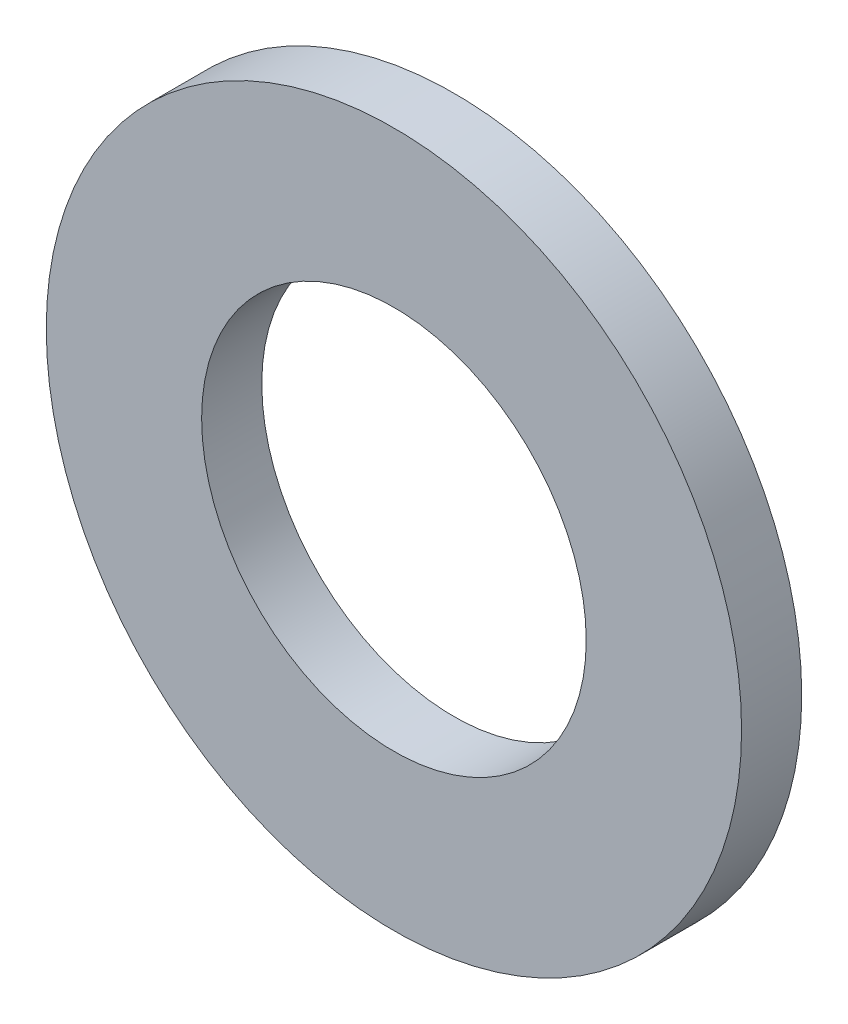
ISO-10303-21;
HEADER;
FILE_DESCRIPTION(('STEP AP214'),'2;1');
FILE_NAME('part.step','',(''),(''),'','','');
FILE_SCHEMA(('AUTOMOTIVE_DESIGN { 1 0 10303 214 1 1 1 1 }'));
ENDSEC;
DATA;
#1=APPLICATION_CONTEXT('core data for automotive mechanical design processes');
#2=APPLICATION_PROTOCOL_DEFINITION('international standard','automotive_design',2000,#1);
#3=PRODUCT_CONTEXT('',#1,'mechanical');
#4=PRODUCT('Part','Part','',(#3));
#5=PRODUCT_RELATED_PRODUCT_CATEGORY('part','',(#4));
#6=PRODUCT_DEFINITION_FORMATION('','',#4);
#7=PRODUCT_DEFINITION_CONTEXT('part definition',#1,'design');
#8=PRODUCT_DEFINITION('design','',#6,#7);
#9=PRODUCT_DEFINITION_SHAPE('','',#8);
#10=(LENGTH_UNIT() NAMED_UNIT(*) SI_UNIT(.MILLI.,.METRE.));
#11=(NAMED_UNIT(*) PLANE_ANGLE_UNIT() SI_UNIT($,.RADIAN.));
#12=(NAMED_UNIT(*) SI_UNIT($,.STERADIAN.) SOLID_ANGLE_UNIT());
#13=UNCERTAINTY_MEASURE_WITH_UNIT(LENGTH_MEASURE(1.E-05),#10,'distance_accuracy_value','');
#14=(GEOMETRIC_REPRESENTATION_CONTEXT(3) GLOBAL_UNCERTAINTY_ASSIGNED_CONTEXT((#13)) GLOBAL_UNIT_ASSIGNED_CONTEXT((#10,
#11,#12)) REPRESENTATION_CONTEXT('',''));
#15=CARTESIAN_POINT('',(0.,0.,0.));
#16=DIRECTION('',(0.,0.,1.));
#17=DIRECTION('',(1.,0.,0.));
#18=AXIS2_PLACEMENT_3D('',#15,#16,#17);
#19=CARTESIAN_POINT('',(0.,0.,0.806449999999998));
#20=DIRECTION('',(0.,0.,1.));
#21=DIRECTION('',(1.,0.,0.));
#22=AXIS2_PLACEMENT_3D('',#19,#20,#21);
#23=PLANE('',#22);
#24=CARTESIAN_POINT('',(0.,0.,0.806449999999998));
#25=DIRECTION('',(0.,0.,1.));
#26=DIRECTION('',(1.,0.,0.));
#27=AXIS2_PLACEMENT_3D('',#24,#25,#26);
#28=CIRCLE('',#27,9.3218);
#29=CARTESIAN_POINT('',(9.3218,0.,0.806449999999998));
#30=VERTEX_POINT('',#29);
#31=EDGE_CURVE('E10',#30,#30,#28,.T.);
#32=ORIENTED_EDGE('',*,*,#31,.T.);
#33=EDGE_LOOP('',(#32));
#34=FACE_BOUND('',#33,.T.);
#35=CARTESIAN_POINT('',(0.,0.,0.806449999999998));
#36=DIRECTION('',(0.,0.,1.));
#37=DIRECTION('',(1.,0.,0.));
#38=AXIS2_PLACEMENT_3D('',#35,#36,#37);
#39=CIRCLE('',#38,5.1562);
#40=CARTESIAN_POINT('',(5.1562,0.,0.806449999999998));
#41=VERTEX_POINT('',#40);
#42=EDGE_CURVE('E44',#41,#41,#39,.T.);
#43=ORIENTED_EDGE('',*,*,#42,.F.);
#44=EDGE_LOOP('',(#43));
#45=FACE_BOUND('',#44,.T.);
#46=ADVANCED_FACE('F37',(#34,#45),#23,.T.);
#47=CARTESIAN_POINT('',(0.,0.,0.806449999999998));
#48=DIRECTION('',(0.,0.,-1.));
#49=DIRECTION('',(-1.,0.,0.));
#50=AXIS2_PLACEMENT_3D('',#47,#48,#49);
#51=CYLINDRICAL_SURFACE('',#50,9.3218);
#52=ORIENTED_EDGE('',*,*,#31,.F.);
#53=EDGE_LOOP('',(#52));
#54=FACE_BOUND('',#53,.T.);
#55=CARTESIAN_POINT('',(0.,0.,-0.806450000000002));
#56=DIRECTION('',(0.,0.,1.));
#57=DIRECTION('',(1.,0.,0.));
#58=AXIS2_PLACEMENT_3D('',#55,#56,#57);
#59=CIRCLE('',#58,9.3218);
#60=CARTESIAN_POINT('',(9.3218,0.,-0.806450000000002));
#61=VERTEX_POINT('',#60);
#62=EDGE_CURVE('E48',#61,#61,#59,.T.);
#63=ORIENTED_EDGE('',*,*,#62,.T.);
#64=EDGE_LOOP('',(#63));
#65=FACE_BOUND('',#64,.T.);
#66=ADVANCED_FACE('F39',(#54,#65),#51,.T.);
#67=CARTESIAN_POINT('',(0.,0.,0.806449999999998));
#68=DIRECTION('',(0.,0.,-1.));
#69=DIRECTION('',(-1.,0.,0.));
#70=AXIS2_PLACEMENT_3D('',#67,#68,#69);
#71=CYLINDRICAL_SURFACE('',#70,5.1562);
#72=ORIENTED_EDGE('',*,*,#42,.T.);
#73=EDGE_LOOP('',(#72));
#74=FACE_BOUND('',#73,.T.);
#75=CARTESIAN_POINT('',(0.,0.,-0.806450000000002));
#76=DIRECTION('',(0.,0.,1.));
#77=DIRECTION('',(1.,0.,0.));
#78=AXIS2_PLACEMENT_3D('',#75,#76,#77);
#79=CIRCLE('',#78,5.1562);
#80=CARTESIAN_POINT('',(5.1562,0.,-0.806450000000002));
#81=VERTEX_POINT('',#80);
#82=EDGE_CURVE('E52',#81,#81,#79,.T.);
#83=ORIENTED_EDGE('',*,*,#82,.F.);
#84=EDGE_LOOP('',(#83));
#85=FACE_BOUND('',#84,.T.);
#86=ADVANCED_FACE('F61',(#74,#85),#71,.F.);
#87=CARTESIAN_POINT('',(0.,0.,-0.806450000000002));
#88=DIRECTION('',(0.,0.,1.));
#89=DIRECTION('',(1.,0.,0.));
#90=AXIS2_PLACEMENT_3D('',#87,#88,#89);
#91=PLANE('',#90);
#92=ORIENTED_EDGE('',*,*,#82,.T.);
#93=EDGE_LOOP('',(#92));
#94=FACE_BOUND('',#93,.T.);
#95=ORIENTED_EDGE('',*,*,#62,.F.);
#96=EDGE_LOOP('',(#95));
#97=FACE_BOUND('',#96,.T.);
#98=ADVANCED_FACE('F58',(#94,#97),#91,.F.);
#99=CLOSED_SHELL('',(#46,#66,#86,#98));
#100=MANIFOLD_SOLID_BREP('B2',#99);
#101=ADVANCED_BREP_SHAPE_REPRESENTATION('',(#18,#100),#14);
#102=SHAPE_DEFINITION_REPRESENTATION(#9,#101);
ENDSEC;
END-ISO-10303-21;
